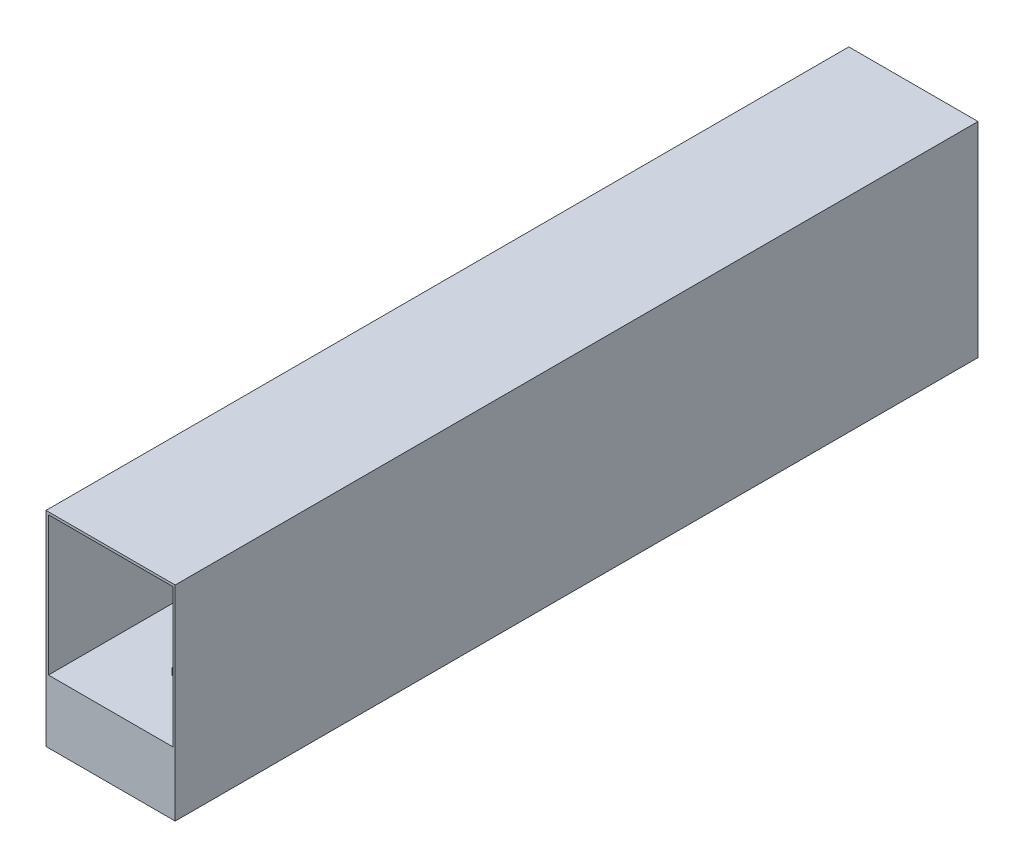
ISO-10303-21;
HEADER;
FILE_DESCRIPTION(('STEP AP214'),'2;1');
FILE_NAME('part.step','',(''),(''),'','','');
FILE_SCHEMA(('AUTOMOTIVE_DESIGN { 1 0 10303 214 1 1 1 1 }'));
ENDSEC;
DATA;
#1=APPLICATION_CONTEXT('core data for automotive mechanical design processes');
#2=APPLICATION_PROTOCOL_DEFINITION('international standard','automotive_design',2000,#1);
#3=PRODUCT_CONTEXT('',#1,'mechanical');
#4=PRODUCT('Part','Part','',(#3));
#5=PRODUCT_RELATED_PRODUCT_CATEGORY('part','',(#4));
#6=PRODUCT_DEFINITION_FORMATION('','',#4);
#7=PRODUCT_DEFINITION_CONTEXT('part definition',#1,'design');
#8=PRODUCT_DEFINITION('design','',#6,#7);
#9=PRODUCT_DEFINITION_SHAPE('','',#8);
#10=(LENGTH_UNIT() NAMED_UNIT(*) SI_UNIT(.MILLI.,.METRE.));
#11=(NAMED_UNIT(*) PLANE_ANGLE_UNIT() SI_UNIT($,.RADIAN.));
#12=(NAMED_UNIT(*) SI_UNIT($,.STERADIAN.) SOLID_ANGLE_UNIT());
#13=UNCERTAINTY_MEASURE_WITH_UNIT(LENGTH_MEASURE(1.E-05),#10,'distance_accuracy_value','');
#14=(GEOMETRIC_REPRESENTATION_CONTEXT(3) GLOBAL_UNCERTAINTY_ASSIGNED_CONTEXT((#13)) GLOBAL_UNIT_ASSIGNED_CONTEXT((#10,
#11,#12)) REPRESENTATION_CONTEXT('',''));
#15=CARTESIAN_POINT('',(0.,0.,0.));
#16=DIRECTION('',(0.,0.,1.));
#17=DIRECTION('',(1.,0.,0.));
#18=AXIS2_PLACEMENT_3D('',#15,#16,#17);
#19=CARTESIAN_POINT('',(0.,0.,6841.63040670794));
#20=DIRECTION('',(-1.,0.,0.));
#21=DIRECTION('',(0.,0.,1.));
#22=AXIS2_PLACEMENT_3D('',#19,#20,#21);
#23=PLANE('',#22);
#24=DIRECTION('',(0.,-1.,0.));
#25=VECTOR('',#24,1.);
#26=CARTESIAN_POINT('',(0.,137.025223745727,6841.63040670794));
#27=LINE('',#26,#25);
#28=CARTESIAN_POINT('',(0.,137.025223745727,6841.63040670794));
#29=VERTEX_POINT('',#28);
#30=CARTESIAN_POINT('',(0.,0.,6841.63040670794));
#31=VERTEX_POINT('',#30);
#32=EDGE_CURVE('E56',#29,#31,#27,.T.);
#33=ORIENTED_EDGE('',*,*,#32,.T.);
#34=DIRECTION('',(0.,0.,-1.));
#35=VECTOR('',#34,1.);
#36=CARTESIAN_POINT('',(0.,0.,6790.42157842922));
#37=LINE('',#36,#35);
#38=CARTESIAN_POINT('',(0.,0.,6790.42157842922));
#39=VERTEX_POINT('',#38);
#40=EDGE_CURVE('E67',#31,#39,#37,.T.);
#41=ORIENTED_EDGE('',*,*,#40,.T.);
#42=DIRECTION('',(0.,1.,0.));
#43=VECTOR('',#42,1.);
#44=CARTESIAN_POINT('',(0.,137.025223745727,6790.42157842922));
#45=LINE('',#44,#43);
#46=CARTESIAN_POINT('',(0.,137.025223745727,6790.42157842922));
#47=VERTEX_POINT('',#46);
#48=EDGE_CURVE('E52',#39,#47,#45,.T.);
#49=ORIENTED_EDGE('',*,*,#48,.T.);
#50=DIRECTION('',(0.,0.,1.));
#51=VECTOR('',#50,1.);
#52=CARTESIAN_POINT('',(0.,137.025223745727,6790.42157842922));
#53=LINE('',#52,#51);
#54=EDGE_CURVE('E12',#47,#29,#53,.T.);
#55=ORIENTED_EDGE('',*,*,#54,.T.);
#56=EDGE_LOOP('',(#33,#41,#49,#55));
#57=FACE_BOUND('',#56,.T.);
#58=ADVANCED_FACE('F47',(#57),#23,.F.);
#59=OPEN_SHELL('',(#58));
#60=SHELL_BASED_SURFACE_MODEL('B2',(#59));
#61=CARTESIAN_POINT('',(-1299.972,-1270.,-8077.2));
#62=DIRECTION('',(1.,0.,0.));
#63=DIRECTION('',(0.,0.,-1.));
#64=AXIS2_PLACEMENT_3D('',#61,#62,#63);
#65=PLANE('',#64);
#66=DIRECTION('',(0.,1.,0.));
#67=VECTOR('',#66,1.);
#68=CARTESIAN_POINT('',(-1299.972,-1270.,8077.2));
#69=LINE('',#68,#67);
#70=CARTESIAN_POINT('',(-1299.972,-1270.,8077.2));
#71=VERTEX_POINT('',#70);
#72=CARTESIAN_POINT('',(-1299.972,2844.8,8077.2));
#73=VERTEX_POINT('',#72);
#74=EDGE_CURVE('E197',#71,#73,#69,.T.);
#75=ORIENTED_EDGE('',*,*,#74,.T.);
#76=DIRECTION('',(0.,0.,1.));
#77=VECTOR('',#76,1.);
#78=CARTESIAN_POINT('',(-1299.972,2844.8,-8077.2));
#79=LINE('',#78,#77);
#80=CARTESIAN_POINT('',(-1299.972,2844.8,-8077.2));
#81=VERTEX_POINT('',#80);
#82=EDGE_CURVE('E45',#81,#73,#79,.T.);
#83=ORIENTED_EDGE('',*,*,#82,.F.);
#84=DIRECTION('',(0.,1.,0.));
#85=VECTOR('',#84,1.);
#86=CARTESIAN_POINT('',(-1299.972,-1270.,-8077.2));
#87=LINE('',#86,#85);
#88=CARTESIAN_POINT('',(-1299.972,-1270.,-8077.2));
#89=VERTEX_POINT('',#88);
#90=EDGE_CURVE('E201',#89,#81,#87,.T.);
#91=ORIENTED_EDGE('',*,*,#90,.F.);
#92=DIRECTION('',(0.,0.,1.));
#93=VECTOR('',#92,1.);
#94=CARTESIAN_POINT('',(-1299.972,-1270.,-8077.2));
#95=LINE('',#94,#93);
#96=EDGE_CURVE('E113',#89,#71,#95,.T.);
#97=ORIENTED_EDGE('',*,*,#96,.T.);
#98=EDGE_LOOP('',(#75,#83,#91,#97));
#99=FACE_BOUND('',#98,.T.);
#100=ADVANCED_FACE('F90',(#99),#65,.F.);
#101=CARTESIAN_POINT('',(-1299.972,2844.8,-8077.2));
#102=DIRECTION('',(0.,-1.,0.));
#103=DIRECTION('',(1.,0.,0.));
#104=AXIS2_PLACEMENT_3D('',#101,#102,#103);
#105=PLANE('',#104);
#106=DIRECTION('',(1.,0.,0.));
#107=VECTOR('',#106,1.);
#108=CARTESIAN_POINT('',(-1299.972,2844.8,8077.2));
#109=LINE('',#108,#107);
#110=CARTESIAN_POINT('',(1299.972,2844.8,8077.2));
#111=VERTEX_POINT('',#110);
#112=EDGE_CURVE('E211',#73,#111,#109,.T.);
#113=ORIENTED_EDGE('',*,*,#112,.T.);
#114=DIRECTION('',(0.,0.,1.));
#115=VECTOR('',#114,1.);
#116=CARTESIAN_POINT('',(1299.972,2844.8,-8077.2));
#117=LINE('',#116,#115);
#118=CARTESIAN_POINT('',(1299.972,2844.8,-8077.2));
#119=VERTEX_POINT('',#118);
#120=EDGE_CURVE('E97',#119,#111,#117,.T.);
#121=ORIENTED_EDGE('',*,*,#120,.F.);
#122=DIRECTION('',(1.,0.,0.));
#123=VECTOR('',#122,1.);
#124=CARTESIAN_POINT('',(-1299.972,2844.8,-8077.2));
#125=LINE('',#124,#123);
#126=EDGE_CURVE('E139',#81,#119,#125,.T.);
#127=ORIENTED_EDGE('',*,*,#126,.F.);
#128=ORIENTED_EDGE('',*,*,#82,.T.);
#129=EDGE_LOOP('',(#113,#121,#127,#128));
#130=FACE_BOUND('',#129,.T.);
#131=ADVANCED_FACE('F225',(#130),#105,.F.);
#132=CARTESIAN_POINT('',(1299.972,-1270.,-8077.2));
#133=DIRECTION('',(1.,0.,0.));
#134=DIRECTION('',(0.,1.,0.));
#135=AXIS2_PLACEMENT_3D('',#132,#133,#134);
#136=PLANE('',#135);
#137=DIRECTION('',(0.,1.,0.));
#138=VECTOR('',#137,1.);
#139=CARTESIAN_POINT('',(1299.972,-1270.,8077.2));
#140=LINE('',#139,#138);
#141=CARTESIAN_POINT('',(1299.972,-1270.,8077.2));
#142=VERTEX_POINT('',#141);
#143=EDGE_CURVE('E214',#142,#111,#140,.T.);
#144=ORIENTED_EDGE('',*,*,#143,.F.);
#145=DIRECTION('',(0.,0.,1.));
#146=VECTOR('',#145,1.);
#147=CARTESIAN_POINT('',(1299.972,-1270.,-8077.2));
#148=LINE('',#147,#146);
#149=CARTESIAN_POINT('',(1299.972,-1270.,-8077.2));
#150=VERTEX_POINT('',#149);
#151=EDGE_CURVE('E220',#150,#142,#148,.T.);
#152=ORIENTED_EDGE('',*,*,#151,.F.);
#153=DIRECTION('',(0.,1.,0.));
#154=VECTOR('',#153,1.);
#155=CARTESIAN_POINT('',(1299.972,-1270.,-8077.2));
#156=LINE('',#155,#154);
#157=EDGE_CURVE('E205',#150,#119,#156,.T.);
#158=ORIENTED_EDGE('',*,*,#157,.T.);
#159=ORIENTED_EDGE('',*,*,#120,.T.);
#160=EDGE_LOOP('',(#144,#152,#158,#159));
#161=FACE_BOUND('',#160,.T.);
#162=ADVANCED_FACE('F223',(#161),#136,.T.);
#163=CARTESIAN_POINT('',(-1299.972,-1270.,-8077.2));
#164=DIRECTION('',(0.,-1.,0.));
#165=DIRECTION('',(1.,0.,0.));
#166=AXIS2_PLACEMENT_3D('',#163,#164,#165);
#167=PLANE('',#166);
#168=DIRECTION('',(1.,0.,0.));
#169=VECTOR('',#168,1.);
#170=CARTESIAN_POINT('',(-1299.972,-1270.,8077.2));
#171=LINE('',#170,#169);
#172=EDGE_CURVE('E203',#71,#142,#171,.T.);
#173=ORIENTED_EDGE('',*,*,#172,.F.);
#174=ORIENTED_EDGE('',*,*,#96,.F.);
#175=DIRECTION('',(1.,0.,0.));
#176=VECTOR('',#175,1.);
#177=CARTESIAN_POINT('',(-1299.972,-1270.,-8077.2));
#178=LINE('',#177,#176);
#179=EDGE_CURVE('E208',#89,#150,#178,.T.);
#180=ORIENTED_EDGE('',*,*,#179,.T.);
#181=ORIENTED_EDGE('',*,*,#151,.T.);
#182=EDGE_LOOP('',(#173,#174,#180,#181));
#183=FACE_BOUND('',#182,.T.);
#184=ADVANCED_FACE('F227',(#183),#167,.T.);
#185=CARTESIAN_POINT('',(-1299.972,2844.8,-8077.2));
#186=DIRECTION('',(0.,0.,-1.));
#187=DIRECTION('',(-1.,0.,0.));
#188=AXIS2_PLACEMENT_3D('',#185,#186,#187);
#189=PLANE('',#188);
#190=ORIENTED_EDGE('',*,*,#90,.T.);
#191=ORIENTED_EDGE('',*,*,#126,.T.);
#192=ORIENTED_EDGE('',*,*,#157,.F.);
#193=ORIENTED_EDGE('',*,*,#179,.F.);
#194=EDGE_LOOP('',(#190,#191,#192,#193));
#195=FACE_BOUND('',#194,.T.);
#196=ADVANCED_FACE('F230',(#195),#189,.T.);
#197=CARTESIAN_POINT('',(-1299.972,2844.8,8077.2));
#198=DIRECTION('',(0.,0.,-1.));
#199=DIRECTION('',(-1.,0.,0.));
#200=AXIS2_PLACEMENT_3D('',#197,#198,#199);
#201=PLANE('',#200);
#202=DIRECTION('',(0.,1.,0.));
#203=VECTOR('',#202,1.);
#204=CARTESIAN_POINT('',(1250.95,2794.,8077.2));
#205=LINE('',#204,#203);
#206=CARTESIAN_POINT('',(1250.95,4.59591574018014E-13,8077.2));
#207=VERTEX_POINT('',#206);
#208=CARTESIAN_POINT('',(1250.95,2794.,8077.2));
#209=VERTEX_POINT('',#208);
#210=EDGE_CURVE('E184',#207,#209,#205,.T.);
#211=ORIENTED_EDGE('',*,*,#210,.F.);
#212=DIRECTION('',(1.,0.,0.));
#213=VECTOR('',#212,1.);
#214=CARTESIAN_POINT('',(-1250.95,0.,8077.2));
#215=LINE('',#214,#213);
#216=CARTESIAN_POINT('',(-1250.95,0.,8077.2));
#217=VERTEX_POINT('',#216);
#218=EDGE_CURVE('E167',#217,#207,#215,.T.);
#219=ORIENTED_EDGE('',*,*,#218,.F.);
#220=DIRECTION('',(0.,-1.,0.));
#221=VECTOR('',#220,1.);
#222=CARTESIAN_POINT('',(-1250.95,2794.,8077.2));
#223=LINE('',#222,#221);
#224=CARTESIAN_POINT('',(-1250.95,2794.,8077.2));
#225=VERTEX_POINT('',#224);
#226=EDGE_CURVE('E176',#225,#217,#223,.T.);
#227=ORIENTED_EDGE('',*,*,#226,.F.);
#228=DIRECTION('',(-1.,0.,0.));
#229=VECTOR('',#228,1.);
#230=CARTESIAN_POINT('',(-1250.95,2794.,8077.2));
#231=LINE('',#230,#229);
#232=EDGE_CURVE('E186',#209,#225,#231,.T.);
#233=ORIENTED_EDGE('',*,*,#232,.F.);
#234=EDGE_LOOP('',(#211,#219,#227,#233));
#235=FACE_BOUND('',#234,.T.);
#236=ORIENTED_EDGE('',*,*,#74,.F.);
#237=ORIENTED_EDGE('',*,*,#172,.T.);
#238=ORIENTED_EDGE('',*,*,#143,.T.);
#239=ORIENTED_EDGE('',*,*,#112,.F.);
#240=EDGE_LOOP('',(#236,#237,#238,#239));
#241=FACE_BOUND('',#240,.T.);
#242=ADVANCED_FACE('F181',(#235,#241),#201,.F.);
#243=CARTESIAN_POINT('',(-1250.95,2794.,-8001.));
#244=DIRECTION('',(-1.,0.,0.));
#245=DIRECTION('',(0.,-1.,0.));
#246=AXIS2_PLACEMENT_3D('',#243,#244,#245);
#247=PLANE('',#246);
#248=DIRECTION('',(0.,0.,1.));
#249=VECTOR('',#248,1.);
#250=CARTESIAN_POINT('',(-1250.95,2794.,-8001.));
#251=LINE('',#250,#249);
#252=CARTESIAN_POINT('',(-1250.95,2794.,-8001.));
#253=VERTEX_POINT('',#252);
#254=EDGE_CURVE('E104',#253,#225,#251,.T.);
#255=ORIENTED_EDGE('',*,*,#254,.T.);
#256=ORIENTED_EDGE('',*,*,#226,.T.);
#257=DIRECTION('',(0.,0.,1.));
#258=VECTOR('',#257,1.);
#259=CARTESIAN_POINT('',(-1250.95,0.,-8001.));
#260=LINE('',#259,#258);
#261=CARTESIAN_POINT('',(-1250.95,0.,-8001.));
#262=VERTEX_POINT('',#261);
#263=EDGE_CURVE('E163',#262,#217,#260,.T.);
#264=ORIENTED_EDGE('',*,*,#263,.F.);
#265=DIRECTION('',(0.,-1.,0.));
#266=VECTOR('',#265,1.);
#267=CARTESIAN_POINT('',(-1250.95,2794.,-8001.));
#268=LINE('',#267,#266);
#269=EDGE_CURVE('E190',#253,#262,#268,.T.);
#270=ORIENTED_EDGE('',*,*,#269,.F.);
#271=EDGE_LOOP('',(#255,#256,#264,#270));
#272=FACE_BOUND('',#271,.T.);
#273=ADVANCED_FACE('F177',(#272),#247,.F.);
#274=CARTESIAN_POINT('',(-1250.95,2794.,-8001.));
#275=DIRECTION('',(0.,-1.,0.));
#276=DIRECTION('',(1.,0.,0.));
#277=AXIS2_PLACEMENT_3D('',#274,#275,#276);
#278=PLANE('',#277);
#279=DIRECTION('',(0.,0.,1.));
#280=VECTOR('',#279,1.);
#281=CARTESIAN_POINT('',(1250.95,2794.,-8001.));
#282=LINE('',#281,#280);
#283=CARTESIAN_POINT('',(1250.95,2794.,-8001.));
#284=VERTEX_POINT('',#283);
#285=EDGE_CURVE('E198',#284,#209,#282,.T.);
#286=ORIENTED_EDGE('',*,*,#285,.T.);
#287=ORIENTED_EDGE('',*,*,#232,.T.);
#288=ORIENTED_EDGE('',*,*,#254,.F.);
#289=DIRECTION('',(1.,0.,0.));
#290=VECTOR('',#289,1.);
#291=CARTESIAN_POINT('',(-1250.95,2794.,-8001.));
#292=LINE('',#291,#290);
#293=EDGE_CURVE('E173',#253,#284,#292,.T.);
#294=ORIENTED_EDGE('',*,*,#293,.T.);
#295=EDGE_LOOP('',(#286,#287,#288,#294));
#296=FACE_BOUND('',#295,.T.);
#297=ADVANCED_FACE('F248',(#296),#278,.T.);
#298=CARTESIAN_POINT('',(1250.95,2794.,-8001.));
#299=DIRECTION('',(-1.,0.,0.));
#300=DIRECTION('',(0.,-1.,0.));
#301=AXIS2_PLACEMENT_3D('',#298,#299,#300);
#302=PLANE('',#301);
#303=DIRECTION('',(0.,0.,1.));
#304=VECTOR('',#303,1.);
#305=CARTESIAN_POINT('',(1250.95,4.59591574018014E-13,-8001.));
#306=LINE('',#305,#304);
#307=CARTESIAN_POINT('',(1250.95,4.59591574018014E-13,-8001.));
#308=VERTEX_POINT('',#307);
#309=EDGE_CURVE('E172',#308,#207,#306,.T.);
#310=ORIENTED_EDGE('',*,*,#309,.T.);
#311=ORIENTED_EDGE('',*,*,#210,.T.);
#312=ORIENTED_EDGE('',*,*,#285,.F.);
#313=DIRECTION('',(0.,-1.,0.));
#314=VECTOR('',#313,1.);
#315=CARTESIAN_POINT('',(1250.95,2794.,-8001.));
#316=LINE('',#315,#314);
#317=EDGE_CURVE('E193',#284,#308,#316,.T.);
#318=ORIENTED_EDGE('',*,*,#317,.T.);
#319=EDGE_LOOP('',(#310,#311,#312,#318));
#320=FACE_BOUND('',#319,.T.);
#321=ADVANCED_FACE('F252',(#320),#302,.T.);
#322=CARTESIAN_POINT('',(-1250.95,0.,-8001.));
#323=DIRECTION('',(0.,-1.,0.));
#324=DIRECTION('',(1.,0.,0.));
#325=AXIS2_PLACEMENT_3D('',#322,#323,#324);
#326=PLANE('',#325);
#327=ORIENTED_EDGE('',*,*,#263,.T.);
#328=ORIENTED_EDGE('',*,*,#218,.T.);
#329=ORIENTED_EDGE('',*,*,#309,.F.);
#330=DIRECTION('',(1.,0.,0.));
#331=VECTOR('',#330,1.);
#332=CARTESIAN_POINT('',(-1250.95,0.,-8001.));
#333=LINE('',#332,#331);
#334=EDGE_CURVE('E170',#262,#308,#333,.T.);
#335=ORIENTED_EDGE('',*,*,#334,.F.);
#336=EDGE_LOOP('',(#327,#328,#329,#335));
#337=FACE_BOUND('',#336,.T.);
#338=ADVANCED_FACE('F164',(#337),#326,.F.);
#339=CARTESIAN_POINT('',(-1250.95,0.,-8001.));
#340=DIRECTION('',(0.,0.,1.));
#341=DIRECTION('',(1.,0.,0.));
#342=AXIS2_PLACEMENT_3D('',#339,#340,#341);
#343=PLANE('',#342);
#344=ORIENTED_EDGE('',*,*,#269,.T.);
#345=ORIENTED_EDGE('',*,*,#334,.T.);
#346=ORIENTED_EDGE('',*,*,#317,.F.);
#347=ORIENTED_EDGE('',*,*,#293,.F.);
#348=EDGE_LOOP('',(#344,#345,#346,#347));
#349=FACE_BOUND('',#348,.T.);
#350=ADVANCED_FACE('F251',(#349),#343,.T.);
#351=CLOSED_SHELL('',(#100,#131,#162,#184,#196,#242,#273,#297,#321,#338,#350));
#352=MANIFOLD_SOLID_BREP('B6',#351);
#353=ADVANCED_BREP_SHAPE_REPRESENTATION('',(#18,#352),#14);
#354=MANIFOLD_SURFACE_SHAPE_REPRESENTATION('',(#18,#60),#14);
#355=SHAPE_REPRESENTATION('',(#18),#14);
#356=SHAPE_DEFINITION_REPRESENTATION(#9,#355);
#357=SHAPE_REPRESENTATION_RELATIONSHIP('','',#355,#353);
#358=SHAPE_REPRESENTATION_RELATIONSHIP('','',#355,#354);
ENDSEC;
END-ISO-10303-21;
